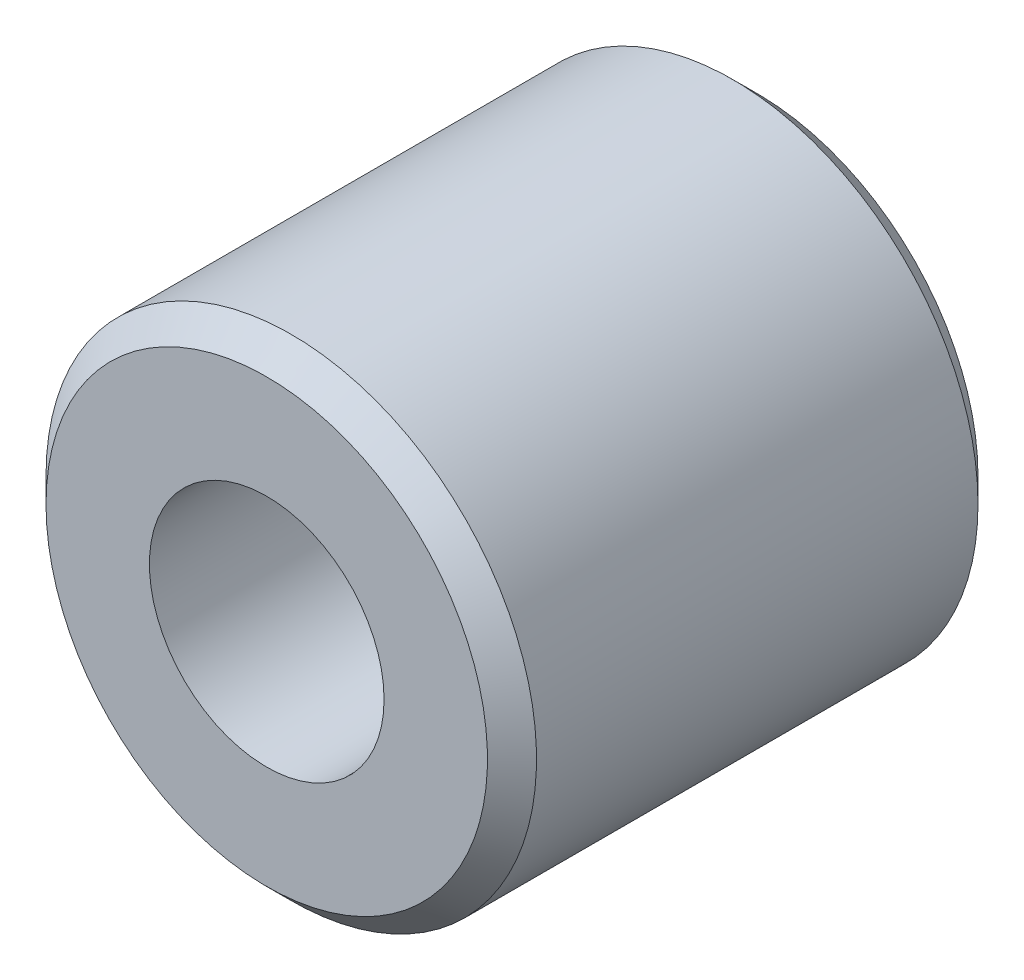
ISO-10303-21;
HEADER;
FILE_DESCRIPTION(('STEP AP214'),'2;1');
FILE_NAME('part.step','',(''),(''),'','','');
FILE_SCHEMA(('AUTOMOTIVE_DESIGN { 1 0 10303 214 1 1 1 1 }'));
ENDSEC;
DATA;
#1=APPLICATION_CONTEXT('core data for automotive mechanical design processes');
#2=APPLICATION_PROTOCOL_DEFINITION('international standard','automotive_design',2000,#1);
#3=PRODUCT_CONTEXT('',#1,'mechanical');
#4=PRODUCT('Part','Part','',(#3));
#5=PRODUCT_RELATED_PRODUCT_CATEGORY('part','',(#4));
#6=PRODUCT_DEFINITION_FORMATION('','',#4);
#7=PRODUCT_DEFINITION_CONTEXT('part definition',#1,'design');
#8=PRODUCT_DEFINITION('design','',#6,#7);
#9=PRODUCT_DEFINITION_SHAPE('','',#8);
#10=(LENGTH_UNIT() NAMED_UNIT(*) SI_UNIT(.MILLI.,.METRE.));
#11=(NAMED_UNIT(*) PLANE_ANGLE_UNIT() SI_UNIT($,.RADIAN.));
#12=(NAMED_UNIT(*) SI_UNIT($,.STERADIAN.) SOLID_ANGLE_UNIT());
#13=UNCERTAINTY_MEASURE_WITH_UNIT(LENGTH_MEASURE(1.E-05),#10,'distance_accuracy_value','');
#14=(GEOMETRIC_REPRESENTATION_CONTEXT(3) GLOBAL_UNCERTAINTY_ASSIGNED_CONTEXT((#13)) GLOBAL_UNIT_ASSIGNED_CONTEXT((#10,
#11,#12)) REPRESENTATION_CONTEXT('',''));
#15=CARTESIAN_POINT('',(0.,0.,0.));
#16=DIRECTION('',(0.,0.,1.));
#17=DIRECTION('',(1.,0.,0.));
#18=AXIS2_PLACEMENT_3D('',#15,#16,#17);
#19=CARTESIAN_POINT('',(0.,0.,7.9375));
#20=DIRECTION('',(0.,0.,-1.));
#21=DIRECTION('',(-1.,0.,0.));
#22=AXIS2_PLACEMENT_3D('',#19,#20,#21);
#23=CYLINDRICAL_SURFACE('',#22,3.96875);
#24=CARTESIAN_POINT('',(0.,0.,7.540625));
#25=DIRECTION('',(0.,0.,1.));
#26=DIRECTION('',(1.,0.,0.));
#27=AXIS2_PLACEMENT_3D('',#24,#25,#26);
#28=CIRCLE('',#27,3.96875);
#29=CARTESIAN_POINT('',(-3.96875,0.,7.540625));
#30=VERTEX_POINT('',#29);
#31=EDGE_CURVE('E54',#30,#30,#28,.F.);
#32=ORIENTED_EDGE('',*,*,#31,.T.);
#33=EDGE_LOOP('',(#32));
#34=FACE_BOUND('',#33,.T.);
#35=CARTESIAN_POINT('',(0.,0.,0.396875));
#36=DIRECTION('',(0.,0.,1.));
#37=DIRECTION('',(1.,0.,0.));
#38=AXIS2_PLACEMENT_3D('',#35,#36,#37);
#39=CIRCLE('',#38,3.96875);
#40=CARTESIAN_POINT('',(3.96875,0.,0.396875));
#41=VERTEX_POINT('',#40);
#42=EDGE_CURVE('E58',#41,#41,#39,.T.);
#43=ORIENTED_EDGE('',*,*,#42,.T.);
#44=EDGE_LOOP('',(#43));
#45=FACE_BOUND('',#44,.T.);
#46=ADVANCED_FACE('F48',(#34,#45),#23,.T.);
#47=CARTESIAN_POINT('',(0.,0.,7.9375));
#48=DIRECTION('',(0.,0.,1.));
#49=DIRECTION('',(1.,0.,0.));
#50=AXIS2_PLACEMENT_3D('',#47,#48,#49);
#51=PLANE('',#50);
#52=CARTESIAN_POINT('',(0.,0.,7.9375));
#53=DIRECTION('',(0.,0.,1.));
#54=DIRECTION('',(1.,0.,0.));
#55=AXIS2_PLACEMENT_3D('',#52,#53,#54);
#56=CIRCLE('',#55,1.89864999999999);
#57=CARTESIAN_POINT('',(1.89864999999999,0.,7.9375));
#58=VERTEX_POINT('',#57);
#59=EDGE_CURVE('E67',#58,#58,#56,.T.);
#60=ORIENTED_EDGE('',*,*,#59,.F.);
#61=EDGE_LOOP('',(#60));
#62=FACE_BOUND('',#61,.T.);
#63=CARTESIAN_POINT('',(0.,0.,7.9375));
#64=DIRECTION('',(0.,0.,1.));
#65=DIRECTION('',(1.,0.,0.));
#66=AXIS2_PLACEMENT_3D('',#63,#64,#65);
#67=CIRCLE('',#66,3.571875);
#68=CARTESIAN_POINT('',(-3.571875,0.,7.9375));
#69=VERTEX_POINT('',#68);
#70=EDGE_CURVE('E62',#69,#69,#67,.T.);
#71=ORIENTED_EDGE('',*,*,#70,.T.);
#72=EDGE_LOOP('',(#71));
#73=FACE_BOUND('',#72,.T.);
#74=ADVANCED_FACE('F83',(#62,#73),#51,.T.);
#75=CARTESIAN_POINT('',(0.,0.,0.));
#76=DIRECTION('',(0.,0.,1.));
#77=DIRECTION('',(1.,0.,0.));
#78=AXIS2_PLACEMENT_3D('',#75,#76,#77);
#79=PLANE('',#78);
#80=CARTESIAN_POINT('',(0.,0.,0.));
#81=DIRECTION('',(0.,0.,1.));
#82=DIRECTION('',(1.,0.,0.));
#83=AXIS2_PLACEMENT_3D('',#80,#81,#82);
#84=CIRCLE('',#83,1.89865);
#85=CARTESIAN_POINT('',(1.89865,0.,0.));
#86=VERTEX_POINT('',#85);
#87=EDGE_CURVE('E70',#86,#86,#84,.T.);
#88=ORIENTED_EDGE('',*,*,#87,.T.);
#89=EDGE_LOOP('',(#88));
#90=FACE_BOUND('',#89,.T.);
#91=CARTESIAN_POINT('',(0.,0.,0.));
#92=DIRECTION('',(0.,0.,1.));
#93=DIRECTION('',(1.,0.,0.));
#94=AXIS2_PLACEMENT_3D('',#91,#92,#93);
#95=CIRCLE('',#94,3.571875);
#96=CARTESIAN_POINT('',(3.571875,0.,0.));
#97=VERTEX_POINT('',#96);
#98=EDGE_CURVE('E12',#97,#97,#95,.F.);
#99=ORIENTED_EDGE('',*,*,#98,.T.);
#100=EDGE_LOOP('',(#99));
#101=FACE_BOUND('',#100,.T.);
#102=ADVANCED_FACE('F74',(#90,#101),#79,.F.);
#103=CARTESIAN_POINT('',(0.,0.,7.9375));
#104=DIRECTION('',(0.,0.,-1.));
#105=DIRECTION('',(-1.,0.,0.));
#106=AXIS2_PLACEMENT_3D('',#103,#104,#105);
#107=CONICAL_SURFACE('',#106,3.571875,0.785398163397446);
#108=CARTESIAN_POINT('',(-3.96875,0.,7.540625));
#109=CARTESIAN_POINT('',(-3.96461588541667,0.,7.54475911458333));
#110=CARTESIAN_POINT('',(-3.96048177083333,0.,7.54889322916666));
#111=CARTESIAN_POINT('',(-3.95221354166667,0.,7.55716145833333));
#112=CARTESIAN_POINT('',(-3.94807942708333,0.,7.56129557291666));
#113=CARTESIAN_POINT('',(-3.93981119791667,0.,7.56956380208333));
#114=CARTESIAN_POINT('',(-3.93567708333333,0.,7.57369791666667));
#115=CARTESIAN_POINT('',(-3.92740885416667,0.,7.58196614583333));
#116=CARTESIAN_POINT('',(-3.92327473958333,0.,7.58610026041667));
#117=CARTESIAN_POINT('',(-3.91500651041667,0.,7.59436848958333));
#118=CARTESIAN_POINT('',(-3.91087239583333,0.,7.59850260416667));
#119=CARTESIAN_POINT('',(-3.90260416666667,0.,7.60677083333333));
#120=CARTESIAN_POINT('',(-3.89847005208333,0.,7.61090494791666));
#121=CARTESIAN_POINT('',(-3.89020182291667,0.,7.61917317708333));
#122=CARTESIAN_POINT('',(-3.88606770833333,0.,7.62330729166666));
#123=CARTESIAN_POINT('',(-3.87779947916667,0.,7.63157552083333));
#124=CARTESIAN_POINT('',(-3.87366536458333,0.,7.63570963541666));
#125=CARTESIAN_POINT('',(-3.86539713541667,0.,7.64397786458333));
#126=CARTESIAN_POINT('',(-3.86126302083333,0.,7.64811197916667));
#127=CARTESIAN_POINT('',(-3.85299479166667,0.,7.65638020833333));
#128=CARTESIAN_POINT('',(-3.84886067708333,0.,7.66051432291667));
#129=CARTESIAN_POINT('',(-3.84059244791667,0.,7.66878255208333));
#130=CARTESIAN_POINT('',(-3.83645833333333,0.,7.67291666666666));
#131=CARTESIAN_POINT('',(-3.82819010416667,0.,7.68118489583333));
#132=CARTESIAN_POINT('',(-3.82405598958333,0.,7.68531901041667));
#133=CARTESIAN_POINT('',(-3.81578776041667,0.,7.69358723958333));
#134=CARTESIAN_POINT('',(-3.81165364583333,0.,7.69772135416667));
#135=CARTESIAN_POINT('',(-3.80338541666667,0.,7.70598958333333));
#136=CARTESIAN_POINT('',(-3.79925130208333,0.,7.71012369791666));
#137=CARTESIAN_POINT('',(-3.79098307291667,0.,7.71839192708333));
#138=CARTESIAN_POINT('',(-3.78684895833333,0.,7.72252604166667));
#139=CARTESIAN_POINT('',(-3.77858072916667,0.,7.73079427083333));
#140=CARTESIAN_POINT('',(-3.77444661458333,0.,7.73492838541666));
#141=CARTESIAN_POINT('',(-3.76617838541667,0.,7.74319661458333));
#142=CARTESIAN_POINT('',(-3.76204427083333,0.,7.74733072916667));
#143=CARTESIAN_POINT('',(-3.75377604166667,0.,7.75559895833333));
#144=CARTESIAN_POINT('',(-3.74964192708333,0.,7.75973307291667));
#145=CARTESIAN_POINT('',(-3.74137369791667,0.,7.76800130208333));
#146=CARTESIAN_POINT('',(-3.73723958333333,0.,7.77213541666667));
#147=CARTESIAN_POINT('',(-3.72897135416667,0.,7.78040364583333));
#148=CARTESIAN_POINT('',(-3.72483723958333,0.,7.78453776041667));
#149=CARTESIAN_POINT('',(-3.71656901041667,0.,7.79280598958333));
#150=CARTESIAN_POINT('',(-3.71243489583333,0.,7.79694010416667));
#151=CARTESIAN_POINT('',(-3.70416666666667,0.,7.80520833333333));
#152=CARTESIAN_POINT('',(-3.70003255208333,0.,7.80934244791667));
#153=CARTESIAN_POINT('',(-3.69176432291667,0.,7.81761067708333));
#154=CARTESIAN_POINT('',(-3.68763020833333,0.,7.82174479166666));
#155=CARTESIAN_POINT('',(-3.67936197916667,0.,7.83001302083333));
#156=CARTESIAN_POINT('',(-3.67522786458333,0.,7.83414713541667));
#157=CARTESIAN_POINT('',(-3.66695963541667,0.,7.84241536458333));
#158=CARTESIAN_POINT('',(-3.66282552083333,0.,7.84654947916667));
#159=CARTESIAN_POINT('',(-3.65455729166667,0.,7.85481770833333));
#160=CARTESIAN_POINT('',(-3.65042317708333,0.,7.85895182291666));
#161=CARTESIAN_POINT('',(-3.64215494791667,0.,7.86722005208333));
#162=CARTESIAN_POINT('',(-3.63802083333333,0.,7.87135416666667));
#163=CARTESIAN_POINT('',(-3.62975260416667,0.,7.87962239583333));
#164=CARTESIAN_POINT('',(-3.62561848958333,0.,7.88375651041667));
#165=CARTESIAN_POINT('',(-3.61735026041667,0.,7.89202473958333));
#166=CARTESIAN_POINT('',(-3.61321614583333,0.,7.89615885416667));
#167=CARTESIAN_POINT('',(-3.60494791666667,0.,7.90442708333333));
#168=CARTESIAN_POINT('',(-3.60081380208333,0.,7.90856119791667));
#169=CARTESIAN_POINT('',(-3.59254557291667,0.,7.91682942708333));
#170=CARTESIAN_POINT('',(-3.58841145833334,0.,7.92096354166667));
#171=CARTESIAN_POINT('',(-3.58014322916667,0.,7.92923177083333));
#172=CARTESIAN_POINT('',(-3.57600911458334,0.,7.93336588541667));
#173=CARTESIAN_POINT('',(-3.571875,0.,7.9375));
#174=B_SPLINE_CURVE_WITH_KNOTS('',3,(#108,#109,#110,#111,#112,#113,#114,#115,#116,#117,#118,
#119,#120,#121,#122,#123,#124,#125,#126,#127,#128,#129,#130,#131,#132,#133,#134,#135,#136,#137,
#138,#139,#140,#141,#142,#143,#144,#145,#146,#147,#148,#149,#150,#151,#152,#153,#154,#155,#156,
#157,#158,#159,#160,#161,#162,#163,#164,#165,#166,#167,#168,#169,#170,#171,#172,#173),
.UNSPECIFIED.,.F.,.F.,(4,2,2,2,2,2,2,2,2,2,2,2,2,2,2,2,2,2,2,2,2,2,2,2,2,2,2,2,2,2,2,2,4),(0.,
0.017539562736464,0.0350791254729268,0.0526186882093902,0.070158250945853,0.0876978136823164,
0.10523737641878,0.122776939155243,0.140316501891706,0.157856064628169,0.175395627364632,
0.192935190101095,0.210474752837559,0.228014315574022,0.245553878310485,0.263093441046948,
0.280633003783411,0.298172566519875,0.315712129256338,0.333251691992801,0.350791254729265,
0.368330817465728,0.385870380202191,0.403409942938654,0.420949505675117,0.438489068411581,
0.456028631148043,0.473568193884506,0.49110775662097,0.508647319357432,0.526186882093896,
0.543726444830359,0.561266007566823),.UNSPECIFIED.);
#175=EDGE_CURVE('BSEAM88',#30,#69,#174,.T.);
#176=ORIENTED_EDGE('',*,*,#31,.F.);
#177=ORIENTED_EDGE('',*,*,#70,.F.);
#178=ORIENTED_EDGE('',*,*,#175,.T.);
#179=ORIENTED_EDGE('',*,*,#175,.F.);
#180=EDGE_LOOP('',(#176,#178,#177,#179));
#181=FACE_BOUND('',#180,.T.);
#182=ADVANCED_FACE('F88',(#181),#107,.T.);
#183=CARTESIAN_POINT('',(0.,0.,0.396875));
#184=DIRECTION('',(0.,0.,1.));
#185=DIRECTION('',(1.,0.,0.));
#186=AXIS2_PLACEMENT_3D('',#183,#184,#185);
#187=CONICAL_SURFACE('',#186,3.96875,0.78539816339745);
#188=ORIENTED_EDGE('',*,*,#98,.F.);
#189=EDGE_LOOP('',(#188));
#190=FACE_BOUND('',#189,.T.);
#191=ORIENTED_EDGE('',*,*,#42,.F.);
#192=EDGE_LOOP('',(#191));
#193=FACE_BOUND('',#192,.T.);
#194=ADVANCED_FACE('F79',(#190,#193),#187,.T.);
#195=CARTESIAN_POINT('',(0.,0.,7.9375));
#196=DIRECTION('',(0.,0.,1.));
#197=DIRECTION('',(1.,0.,0.));
#198=AXIS2_PLACEMENT_3D('',#195,#196,#197);
#199=CYLINDRICAL_SURFACE('',#198,1.89864999999999);
#200=ORIENTED_EDGE('',*,*,#87,.F.);
#201=EDGE_LOOP('',(#200));
#202=FACE_BOUND('',#201,.T.);
#203=ORIENTED_EDGE('',*,*,#59,.T.);
#204=EDGE_LOOP('',(#203));
#205=FACE_BOUND('',#204,.T.);
#206=ADVANCED_FACE('F76',(#202,#205),#199,.F.);
#207=CLOSED_SHELL('',(#46,#74,#102,#182,#194,#206));
#208=MANIFOLD_SOLID_BREP('B2',#207);
#209=ADVANCED_BREP_SHAPE_REPRESENTATION('',(#18,#208),#14);
#210=SHAPE_DEFINITION_REPRESENTATION(#9,#209);
ENDSEC;
END-ISO-10303-21;
